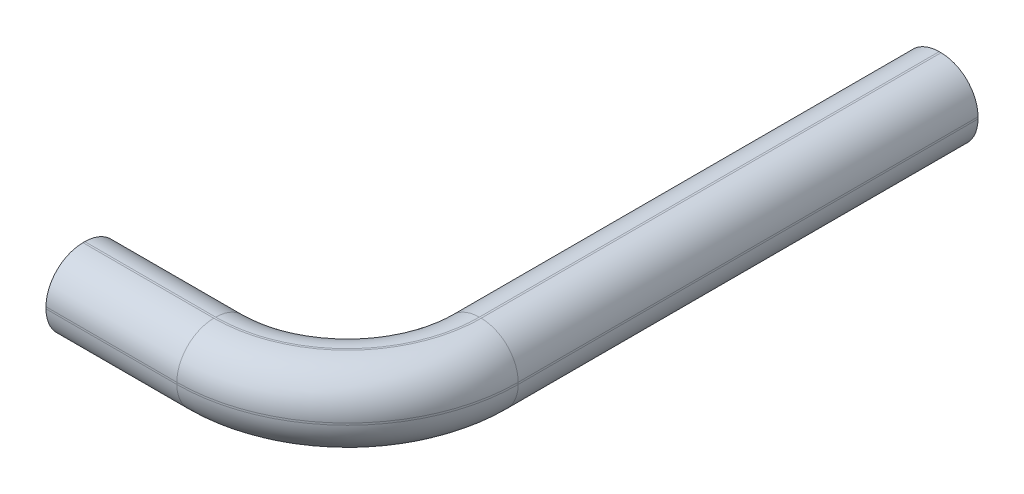
ISO-10303-21;
HEADER;
FILE_DESCRIPTION(('STEP AP214'),'2;1');
FILE_NAME('part.step','',(''),(''),'','','');
FILE_SCHEMA(('AUTOMOTIVE_DESIGN { 1 0 10303 214 1 1 1 1 }'));
ENDSEC;
DATA;
#1=APPLICATION_CONTEXT('core data for automotive mechanical design processes');
#2=APPLICATION_PROTOCOL_DEFINITION('international standard','automotive_design',2000,#1);
#3=PRODUCT_CONTEXT('',#1,'mechanical');
#4=PRODUCT('Part','Part','',(#3));
#5=PRODUCT_RELATED_PRODUCT_CATEGORY('part','',(#4));
#6=PRODUCT_DEFINITION_FORMATION('','',#4);
#7=PRODUCT_DEFINITION_CONTEXT('part definition',#1,'design');
#8=PRODUCT_DEFINITION('design','',#6,#7);
#9=PRODUCT_DEFINITION_SHAPE('','',#8);
#10=(LENGTH_UNIT() NAMED_UNIT(*) SI_UNIT(.MILLI.,.METRE.));
#11=(NAMED_UNIT(*) PLANE_ANGLE_UNIT() SI_UNIT($,.RADIAN.));
#12=(NAMED_UNIT(*) SI_UNIT($,.STERADIAN.) SOLID_ANGLE_UNIT());
#13=UNCERTAINTY_MEASURE_WITH_UNIT(LENGTH_MEASURE(1.E-05),#10,'distance_accuracy_value','');
#14=(GEOMETRIC_REPRESENTATION_CONTEXT(3) GLOBAL_UNCERTAINTY_ASSIGNED_CONTEXT((#13)) GLOBAL_UNIT_ASSIGNED_CONTEXT((#10,
#11,#12)) REPRESENTATION_CONTEXT('',''));
#15=CARTESIAN_POINT('',(0.,0.,0.));
#16=DIRECTION('',(0.,0.,1.));
#17=DIRECTION('',(1.,0.,0.));
#18=AXIS2_PLACEMENT_3D('',#15,#16,#17);
#19=CARTESIAN_POINT('',(21.45999826,0.00999666000000374,1.85000192));
#20=DIRECTION('',(0.,1.,0.));
#21=DIRECTION('',(0.,0.,1.));
#22=AXIS2_PLACEMENT_3D('',#19,#20,#21);
#23=TOROIDAL_SURFACE('',#22,1.39,0.389999999999998);
#24=CARTESIAN_POINT('',(21.45999826,0.009996660000003,1.85000192));
#25=DIRECTION('',(0.,-1.,0.));
#26=DIRECTION('',(0.,0.,-1.));
#27=AXIS2_PLACEMENT_3D('',#24,#25,#26);
#28=CIRCLE('',#27,1.);
#29=CARTESIAN_POINT('',(22.45999826,0.00999666000000325,1.85000192));
#30=VERTEX_POINT('',#29);
#31=CARTESIAN_POINT('',(21.45999826,0.00999666000000301,2.85000192));
#32=VERTEX_POINT('',#31);
#33=EDGE_CURVE('E126',#30,#32,#28,.T.);
#34=ORIENTED_EDGE('',*,*,#33,.T.);
#35=CARTESIAN_POINT('',(21.45999826,0.009996660000003,3.24000192));
#36=DIRECTION('',(-1.,0.,0.));
#37=DIRECTION('',(0.,-1.,0.));
#38=AXIS2_PLACEMENT_3D('',#35,#36,#37);
#39=CIRCLE('',#38,0.39);
#40=CARTESIAN_POINT('',(21.45999826,0.399996660000002,3.24000192));
#41=VERTEX_POINT('',#40);
#42=EDGE_CURVE('E138',#41,#32,#39,.T.);
#43=ORIENTED_EDGE('',*,*,#42,.F.);
#44=CARTESIAN_POINT('',(21.45999826,0.399996660000002,3.24000192));
#45=CARTESIAN_POINT('',(21.4774583821445,0.399996659845648,3.23998873292312));
#46=CARTESIAN_POINT('',(21.4949183122406,0.399996659365852,3.23965029009866));
#47=CARTESIAN_POINT('',(21.5298131957279,0.399996658592444,3.23832345601826));
#48=CARTESIAN_POINT('',(21.5472481494881,0.399996658298828,3.23733507446698));
#49=CARTESIAN_POINT('',(21.5820690346497,0.399996658734792,3.23470892375237));
#50=CARTESIAN_POINT('',(21.5994549659832,0.399996659464374,3.23307115369029));
#51=CARTESIAN_POINT('',(21.6341545950525,0.399996659760702,3.22915163968367));
#52=CARTESIAN_POINT('',(21.6514682915044,0.399996659327428,3.22686988434172));
#53=CARTESIAN_POINT('',(21.6859972984439,0.399996659468801,3.2216536519412));
#54=CARTESIAN_POINT('',(21.703212605565,0.399996660043483,3.21871915268361));
#55=CARTESIAN_POINT('',(21.7326278028288,0.399996644775772,3.21317043130668));
#56=CARTESIAN_POINT('',(21.7448555795716,0.399996633576253,3.21070418444168));
#57=CARTESIAN_POINT('',(21.7576352428846,0.399996634639878,3.2079060517208));
#58=CARTESIAN_POINT('',(21.758231243389,0.399996634718728,3.20777505100112));
#59=CARTESIAN_POINT('',(21.768376294686,0.399996636175981,3.2055378133914));
#60=CARTESIAN_POINT('',(21.7779021415403,0.399996639280238,3.20332611778435));
#61=CARTESIAN_POINT('',(21.8084565479244,0.399996647771011,3.19589357633679));
#62=CARTESIAN_POINT('',(21.8293917642789,0.399996651344799,3.19028296387726));
#63=CARTESIAN_POINT('',(21.8671858225316,0.399996656552783,3.17919693822005));
#64=CARTESIAN_POINT('',(21.8840923230272,0.399996658421747,3.173883185984));
#65=CARTESIAN_POINT('',(21.908135233255,0.399996659603422,3.1658223550518));
#66=CARTESIAN_POINT('',(21.9153593604772,0.399996659765444,3.16333441572606));
#67=CARTESIAN_POINT('',(21.9396438042091,0.399996660120523,3.15475219280093));
#68=CARTESIAN_POINT('',(21.956610455274,0.399996660051575,3.14839014561441));
#69=CARTESIAN_POINT('',(21.9906639980062,0.399996659654268,3.13487121416756));
#70=CARTESIAN_POINT('',(22.0077450994579,0.399996659320144,3.12769974138968));
#71=CARTESIAN_POINT('',(22.0320499529894,0.399996654020013,3.1169326223023));
#72=CARTESIAN_POINT('',(22.039393196791,0.399996651776192,3.11360460303651));
#73=CARTESIAN_POINT('',(22.0565066856184,0.399996644896893,3.10566891938115));
#74=CARTESIAN_POINT('',(22.0662535707215,0.39999663970775,3.1010107649221));
#75=CARTESIAN_POINT('',(22.0929031313145,0.399996624664596,3.08788586615824));
#76=CARTESIAN_POINT('',(22.1096901155138,0.399996614230787,3.07918285354265));
#77=CARTESIAN_POINT('',(22.1428916489718,0.399996595116087,3.06109285158247));
#78=CARTESIAN_POINT('',(22.1593061842663,0.399996586435262,3.05170583664812));
#79=CARTESIAN_POINT('',(22.1917349327225,0.399996573560348,3.03226306688608));
#80=CARTESIAN_POINT('',(22.2077491377087,0.399996569366351,3.02220729841626));
#81=CARTESIAN_POINT('',(22.2393495176332,0.399996566530956,3.0014443243548));
#82=CARTESIAN_POINT('',(22.254935691124,0.399996567889578,2.99073711656043));
#83=CARTESIAN_POINT('',(22.2856538341199,0.399996575840703,2.96869013944598));
#84=CARTESIAN_POINT('',(22.3007858098185,0.399996582433135,2.95735037875733));
#85=CARTESIAN_POINT('',(22.330567551516,0.39999659894139,2.93405565200767));
#86=CARTESIAN_POINT('',(22.3452173322883,0.399996608857112,2.92210070482319));
#87=CARTESIAN_POINT('',(22.3740172402423,0.399996629054596,2.89760410755543));
#88=CARTESIAN_POINT('',(22.3881673912198,0.399996639336341,2.88506248547984));
#89=CARTESIAN_POINT('',(22.415915228668,0.399996654288873,2.85938441115303));
#90=CARTESIAN_POINT('',(22.429512950834,0.399996658960024,2.84624799745069));
#91=CARTESIAN_POINT('',(22.44925854725,0.399996660496644,2.82649661407952));
#92=CARTESIAN_POINT('',(22.4555870467816,0.399996660165179,2.82006014742043));
#93=CARTESIAN_POINT('',(22.4773478368829,0.399996657404839,2.79749417074201));
#94=CARTESIAN_POINT('',(22.4924593380152,0.399996652605717,2.78105175384062));
#95=CARTESIAN_POINT('',(22.5178069405613,0.399996635012539,2.75210817698515));
#96=CARTESIAN_POINT('',(22.5282355827104,0.399996624796594,2.73977461373994));
#97=CARTESIAN_POINT('',(22.5450048703864,0.399996604989869,2.71922335923224));
#98=CARTESIAN_POINT('',(22.5514742135191,0.399996596481087,2.71111043229161));
#99=CARTESIAN_POINT('',(22.5697119210875,0.399996572967516,2.6876987212134));
#100=CARTESIAN_POINT('',(22.5812521794528,0.399996558670009,2.672221045683));
#101=CARTESIAN_POINT('',(22.6025410153385,0.399996542403962,2.64236569371662));
#102=CARTESIAN_POINT('',(22.6123532386915,0.399996539343317,2.62803325504069));
#103=CARTESIAN_POINT('',(22.6322923379845,0.399996542017605,2.59768418829223));
#104=CARTESIAN_POINT('',(22.6423666331882,0.399996548578022,2.58163296021882));
#105=CARTESIAN_POINT('',(22.6618461200804,0.399996564443458,2.54913034250503));
#106=CARTESIAN_POINT('',(22.6712513297791,0.399996573748403,2.53267896365177));
#107=CARTESIAN_POINT('',(22.6893745796057,0.399996594737633,2.49940277500946));
#108=CARTESIAN_POINT('',(22.6980926480219,0.39999660642182,2.48257798062975));
#109=CARTESIAN_POINT('',(22.7148283552992,0.399996628592385,2.44858471096698));
#110=CARTESIAN_POINT('',(22.7228460329741,0.399996639078828,2.43141625479362));
#111=CARTESIAN_POINT('',(22.738162769283,0.399996654750108,2.39676312886538));
#112=CARTESIAN_POINT('',(22.7454618779783,0.399996659935314,2.37927848123953));
#113=CARTESIAN_POINT('',(22.7587949224596,0.399996660059553,2.34542804965404));
#114=CARTESIAN_POINT('',(22.7648832966458,0.399996655779432,2.32908365555748));
#115=CARTESIAN_POINT('',(22.7764608936656,0.399996650224028,2.29618492391058));
#116=CARTESIAN_POINT('',(22.7819501429025,0.399996648948613,2.2796305956479));
#117=CARTESIAN_POINT('',(22.7923218320888,0.399996649772732,2.24633259126315));
#118=CARTESIAN_POINT('',(22.7972042733396,0.399996651872258,2.22958891554726));
#119=CARTESIAN_POINT('',(22.8063441252498,0.399996661289691,2.19593202896907));
#120=CARTESIAN_POINT('',(22.8106015110259,0.399996668607806,2.17901881138599));
#121=CARTESIAN_POINT('',(22.8185339557722,0.399996646317903,2.14505300174819));
#122=CARTESIAN_POINT('',(22.8222089671158,0.399996616706867,2.12800039841433));
#123=CARTESIAN_POINT('',(22.8270925724075,0.399996606910781,2.10258411233844));
#124=CARTESIAN_POINT('',(22.8285954617571,0.399996609107716,2.09427651277749));
#125=CARTESIAN_POINT('',(22.8334659071701,0.399996618857504,2.06586003038684));
#126=CARTESIAN_POINT('',(22.8364628138281,0.399996629590214,2.04568616320354));
#127=CARTESIAN_POINT('',(22.8408475364596,0.399996643943672,2.01089761606242));
#128=CARTESIAN_POINT('',(22.8424509216952,0.399996648714617,1.99630952544468));
#129=CARTESIAN_POINT('',(22.8448714441021,0.399996654865008,1.97054674283321));
#130=CARTESIAN_POINT('',(22.8457848503326,0.399996656779789,1.95938102079739));
#131=CARTESIAN_POINT('',(22.8478721005293,0.399996660043118,1.92946172211877));
#132=CARTESIAN_POINT('',(22.8488033713497,0.399996660129923,1.91069066243443));
#133=CARTESIAN_POINT('',(22.8497795770226,0.399996659881555,1.87794357231215));
#134=CARTESIAN_POINT('',(22.849990560871,0.399996659648884,1.86397230224356));
#135=CARTESIAN_POINT('',(22.84999826,0.399996660000002,1.85000192));
#136=B_SPLINE_CURVE_WITH_KNOTS('',3,(#44,#45,#46,#47,#48,#49,#50,#51,#52,#53,#54,#55,#56,#57,
#58,#59,#60,#61,#62,#63,#64,#65,#66,#67,#68,#69,#70,#71,#72,#73,#74,#75,#76,#77,#78,#79,#80,#81,
#82,#83,#84,#85,#86,#87,#88,#89,#90,#91,#92,#93,#94,#95,#96,#97,#98,#99,#100,#101,#102,#103,
#104,#105,#106,#107,#108,#109,#110,#111,#112,#113,#114,#115,#116,#117,#118,#119,#120,#121,#122,
#123,#124,#125,#126,#127,#128,#129,#130,#131,#132,#133,#134,#135),.UNSPECIFIED.,.F.,.F.,(4,2,2,
2,2,2,2,2,2,2,2,2,2,2,2,2,2,2,2,2,2,2,2,2,2,2,2,2,2,2,2,2,2,2,2,2,2,2,2,2,2,2,2,2,2,4),(0.,
0.0523774607925619,0.104754139521095,0.157130890738411,0.209508568990691,0.261888028816525,
0.299304552687161,0.301135235463463,0.330470965905401,0.395466846147935,0.448619126899979,
0.471540121214233,0.525886523285258,0.58144776916993,0.605633415696794,0.638038989472104,
0.694748358110775,0.751459849440195,0.808172498001421,0.864885338337366,0.921597404993741,
0.97830773251999,1.03501535547025,1.09171930840444,1.11879832247491,1.18576343180251,
1.23420886094146,1.26533626394515,1.32323610769921,1.37533261767111,1.43216846145184,
1.48900277476456,1.54583474710009,1.60266356796249,1.65948842686979,1.71180145625224,
1.76411217927766,1.81642279010981,1.86873548284502,1.92105245149676,1.94637851435654,
2.00754127614339,2.05156216561878,2.08516840424163,2.14153463288351,2.18344647938295),.UNSPECIFIED.);
#137=CARTESIAN_POINT('',(22.84999826,0.399996660000002,1.85000192));
#138=VERTEX_POINT('',#137);
#139=EDGE_CURVE('E196',#41,#138,#136,.T.);
#140=ORIENTED_EDGE('',*,*,#139,.T.);
#141=CARTESIAN_POINT('',(22.84999826,0.00999666000000301,1.85000192));
#142=DIRECTION('',(0.,0.,1.));
#143=DIRECTION('',(1.,0.,0.));
#144=AXIS2_PLACEMENT_3D('',#141,#142,#143);
#145=CIRCLE('',#144,0.389999999999999);
#146=EDGE_CURVE('E185',#138,#30,#145,.T.);
#147=ORIENTED_EDGE('',*,*,#146,.T.);
#148=EDGE_LOOP('',(#34,#43,#140,#147));
#149=FACE_BOUND('',#148,.T.);
#150=ADVANCED_FACE('F17',(#149),#23,.T.);
#151=CARTESIAN_POINT('',(22.86999666,0.009996660000003,1.85000032));
#152=DIRECTION('',(0.,0.,-1.));
#153=DIRECTION('',(0.,1.,0.));
#154=AXIS2_PLACEMENT_3D('',#151,#152,#153);
#155=CYLINDRICAL_SURFACE('',#154,0.39);
#156=CARTESIAN_POINT('',(22.86999666,0.00999666000000301,1.85000032));
#157=DIRECTION('',(0.,0.,1.));
#158=DIRECTION('',(1.,0.,0.));
#159=AXIS2_PLACEMENT_3D('',#156,#157,#158);
#160=CIRCLE('',#159,0.389999999999998);
#161=CARTESIAN_POINT('',(23.25999666,0.00999666000000302,1.85000032));
#162=VERTEX_POINT('',#161);
#163=CARTESIAN_POINT('',(22.86999666,0.39999666,1.85000032));
#164=VERTEX_POINT('',#163);
#165=EDGE_CURVE('E115',#162,#164,#160,.T.);
#166=ORIENTED_EDGE('',*,*,#165,.F.);
#167=DIRECTION('',(0.,0.,1.));
#168=VECTOR('',#167,1.);
#169=CARTESIAN_POINT('',(23.25999666,0.00999666000000302,3.65000032));
#170=LINE('',#169,#168);
#171=CARTESIAN_POINT('',(23.25999666,0.00999666000000352,-2.99999908));
#172=VERTEX_POINT('',#171);
#173=EDGE_CURVE('E141',#162,#172,#170,.F.);
#174=ORIENTED_EDGE('',*,*,#173,.T.);
#175=CARTESIAN_POINT('',(22.86999666,0.00999666000000408,-2.99999908));
#176=DIRECTION('',(0.,0.,-1.));
#177=DIRECTION('',(0.,1.,0.));
#178=AXIS2_PLACEMENT_3D('',#175,#176,#177);
#179=CIRCLE('',#178,0.39);
#180=CARTESIAN_POINT('',(22.86999666,0.399996660000001,-2.99999908));
#181=VERTEX_POINT('',#180);
#182=EDGE_CURVE('E21',#172,#181,#179,.F.);
#183=ORIENTED_EDGE('',*,*,#182,.T.);
#184=DIRECTION('',(0.,0.,-1.));
#185=VECTOR('',#184,1.);
#186=CARTESIAN_POINT('',(22.86999666,0.39999666,3.65000032));
#187=LINE('',#186,#185);
#188=EDGE_CURVE('E137',#181,#164,#187,.F.);
#189=ORIENTED_EDGE('',*,*,#188,.T.);
#190=EDGE_LOOP('',(#166,#174,#183,#189));
#191=FACE_BOUND('',#190,.T.);
#192=ADVANCED_FACE('F140',(#191),#155,.T.);
#193=CARTESIAN_POINT('',(21.45999666,0.00999666000000435,1.85000032));
#194=DIRECTION('',(0.,-1.,0.));
#195=DIRECTION('',(1.,0.,0.));
#196=AXIS2_PLACEMENT_3D('',#193,#194,#195);
#197=TOROIDAL_SURFACE('',#196,1.41,0.389999999999998);
#198=CARTESIAN_POINT('',(21.45999666,0.00999666000000323,1.85000032));
#199=DIRECTION('',(0.,1.,0.));
#200=DIRECTION('',(0.,0.,1.));
#201=AXIS2_PLACEMENT_3D('',#198,#199,#200);
#202=CIRCLE('',#201,1.8);
#203=CARTESIAN_POINT('',(21.45999666,0.00999666000000293,3.65000032));
#204=VERTEX_POINT('',#203);
#205=EDGE_CURVE('E163',#162,#204,#202,.F.);
#206=ORIENTED_EDGE('',*,*,#205,.F.);
#207=ORIENTED_EDGE('',*,*,#165,.T.);
#208=CARTESIAN_POINT('',(22.86999666,0.399996660000001,1.85000032));
#209=CARTESIAN_POINT('',(22.8699834738934,0.399996659844008,1.86771156606512));
#210=CARTESIAN_POINT('',(22.8696403311503,0.399996659366847,1.8854226203339));
#211=CARTESIAN_POINT('',(22.8682947079682,0.39999665860504,1.92081940102775));
#212=CARTESIAN_POINT('',(22.8672922372201,0.399996658320391,1.93850512782124));
#213=CARTESIAN_POINT('',(22.8646285311604,0.399996658778406,1.97382685823295));
#214=CARTESIAN_POINT('',(22.8629672948479,0.399996659521071,1.99146286177556));
#215=CARTESIAN_POINT('',(22.8589915272914,0.3999966597775,2.02666159094361));
#216=CARTESIAN_POINT('',(22.8566769844606,0.399996659291243,2.04422431526377));
#217=CARTESIAN_POINT('',(22.8513858150336,0.399996659332336,2.07924997122972));
#218=CARTESIAN_POINT('',(22.84840916596,0.399996659859721,2.09671289946693));
#219=CARTESIAN_POINT('',(22.8427804882697,0.399996644037528,2.12655114309181));
#220=CARTESIAN_POINT('',(22.8402786338937,0.399996632466058,2.13895476153983));
#221=CARTESIAN_POINT('',(22.8374395199207,0.399996633521755,2.15192227095209));
#222=CARTESIAN_POINT('',(22.8373057586124,0.399996633601819,2.15253085021228));
#223=CARTESIAN_POINT('',(22.8350339016457,0.399996635081451,2.16283293584828));
#224=CARTESIAN_POINT('',(22.8327885180159,0.399996638334016,2.17250283527878));
#225=CARTESIAN_POINT('',(22.8252473168779,0.399996647213651,2.20349994730745));
#226=CARTESIAN_POINT('',(22.8195565199063,0.39999665093203,2.22473255343881));
#227=CARTESIAN_POINT('',(22.8083133592039,0.399996656369084,2.26305963367479));
#228=CARTESIAN_POINT('',(22.8029250844176,0.399996658328797,2.28020248498067));
#229=CARTESIAN_POINT('',(22.7947485013794,0.399996659574784,2.30459026579817));
#230=CARTESIAN_POINT('',(22.7922227048683,0.399996659747436,2.31192405550837));
#231=CARTESIAN_POINT('',(22.7835125323558,0.399996660125175,2.33656918347991));
#232=CARTESIAN_POINT('',(22.7770564132421,0.399996660050672,2.35378545928334));
#233=CARTESIAN_POINT('',(22.763341698692,0.399996659646232,2.38832919714392));
#234=CARTESIAN_POINT('',(22.7560687159418,0.399996659310782,2.40565094827088));
#235=CARTESIAN_POINT('',(22.74515079435,0.399996653888017,2.43029513405837));
#236=CARTESIAN_POINT('',(22.7417772094424,0.399996651592009,2.43773872933787));
#237=CARTESIAN_POINT('',(22.7337297441021,0.399996644544749,2.4550931384075));
#238=CARTESIAN_POINT('',(22.729004558796,0.399996639223407,2.46498021517213));
#239=CARTESIAN_POINT('',(22.715690798836,0.399996623793767,2.49201308214193));
#240=CARTESIAN_POINT('',(22.7068625602343,0.399996613088468,2.50904151756037));
#241=CARTESIAN_POINT('',(22.6885122808103,0.399996593472364,2.54272060042666));
#242=CARTESIAN_POINT('',(22.6789902140697,0.399996584561628,2.55937123373104));
#243=CARTESIAN_POINT('',(22.6592677324851,0.399996571342515,2.59226642455319));
#244=CARTESIAN_POINT('',(22.6490673038277,0.399996567034232,2.60851097379264));
#245=CARTESIAN_POINT('',(22.6280056503883,0.399996564115341,2.64056589209569));
#246=CARTESIAN_POINT('',(22.6171444233827,0.399996565504752,2.65637625969809));
#247=CARTESIAN_POINT('',(22.5947803170077,0.399996573655436,2.68753626295496));
#248=CARTESIAN_POINT('',(22.5832774463915,0.399996580416636,2.70288590489022));
#249=CARTESIAN_POINT('',(22.5596476671389,0.399996597350541,2.73309605871168));
#250=CARTESIAN_POINT('',(22.5475207776355,0.399996607523141,2.74795658557166));
#251=CARTESIAN_POINT('',(22.5226718371929,0.399996628246696,2.77717078076171));
#252=CARTESIAN_POINT('',(22.5099498146394,0.399996638797632,2.79152447320867));
#253=CARTESIAN_POINT('',(22.4839024932627,0.399996654137991,2.81967155962929));
#254=CARTESIAN_POINT('',(22.4705772334974,0.399996658927787,2.83346498976896));
#255=CARTESIAN_POINT('',(22.450528513273,0.399996660513075,2.85350761802609));
#256=CARTESIAN_POINT('',(22.4439860516507,0.399996660174899,2.85993996317996));
#257=CARTESIAN_POINT('',(22.4210851289351,0.399996657350549,2.88202174488437));
#258=CARTESIAN_POINT('',(22.4044098180134,0.399996652440645,2.89734631767799));
#259=CARTESIAN_POINT('',(22.3750623049468,0.399996634384998,2.92304628829763));
#260=CARTESIAN_POINT('',(22.3625602069177,0.399996623896237,2.9336171165055));
#261=CARTESIAN_POINT('',(22.3417191119664,0.399996603539686,2.95062285725828));
#262=CARTESIAN_POINT('',(22.3334860586981,0.399996594785247,2.95718791612231));
#263=CARTESIAN_POINT('',(22.3097321486737,0.399996570583808,2.97569182060513));
#264=CARTESIAN_POINT('',(22.2940298354364,0.399996555852202,2.98739928475022));
#265=CARTESIAN_POINT('',(22.2637478476626,0.399996539056733,3.00899171682302));
#266=CARTESIAN_POINT('',(22.2492142525213,0.39999653586709,3.01894151693539));
#267=CARTESIAN_POINT('',(22.218433910614,0.399996538541784,3.03916395544137));
#268=CARTESIAN_POINT('',(22.2021519408602,0.399996545259748,3.04938306668006));
#269=CARTESIAN_POINT('',(22.1691820829184,0.399996561545753,3.06914255448146));
#270=CARTESIAN_POINT('',(22.1524942057089,0.399996571113717,3.07868294937397));
#271=CARTESIAN_POINT('',(22.1187396499063,0.399996592717916,3.09706667989181));
#272=CARTESIAN_POINT('',(22.1016729869953,0.399996604754051,3.10591004430606));
#273=CARTESIAN_POINT('',(22.0671910399812,0.399996627603857,3.12288626442396));
#274=CARTESIAN_POINT('',(22.0497757753255,0.399996638417597,3.13101915962747));
#275=CARTESIAN_POINT('',(22.0146244854267,0.399996654582078,3.14655598165377));
#276=CARTESIAN_POINT('',(21.9968884827037,0.399996659933201,3.15395995942271));
#277=CARTESIAN_POINT('',(21.9625508348962,0.3999966600615,3.16748480928626));
#278=CARTESIAN_POINT('',(21.9459708777452,0.399996655644177,3.1736608789045));
#279=CARTESIAN_POINT('',(21.9125980096557,0.3999966499106,3.18540525068041));
#280=CARTESIAN_POINT('',(21.8958051082208,0.399996648594209,3.19097357985546));
#281=CARTESIAN_POINT('',(21.8620272383138,0.39999664944778,3.20149469230311));
#282=CARTESIAN_POINT('',(21.8450422703146,0.399996651617734,3.20644747709118));
#283=CARTESIAN_POINT('',(21.8109003665492,0.399996661329718,3.21571903385511));
#284=CARTESIAN_POINT('',(21.7937434240082,0.39999666887196,3.22003778074789));
#285=CARTESIAN_POINT('',(21.7592881555852,0.399996645882967,3.22808453084633));
#286=CARTESIAN_POINT('',(21.7419898182866,0.399996615348625,3.23181248584364));
#287=CARTESIAN_POINT('',(21.7161972885346,0.39999660514611,3.23676848905706));
#288=CARTESIAN_POINT('',(21.7077599355743,0.399996607373827,3.23829479293726));
#289=CARTESIAN_POINT('',(21.678927916842,0.39999661734722,3.24323584841014));
#290=CARTESIAN_POINT('',(21.6584673843369,0.399996628443019,3.24627485795784));
#291=CARTESIAN_POINT('',(21.6231889707748,0.399996643285003,3.25072066528652));
#292=CARTESIAN_POINT('',(21.6083980634824,0.399996648219715,3.25234618971042));
#293=CARTESIAN_POINT('',(21.5822624228597,0.399996654604887,3.25480165183358));
#294=CARTESIAN_POINT('',(21.570926747509,0.399996656602316,3.25572880096307));
#295=CARTESIAN_POINT('',(21.5405633960291,0.399996660016711,3.25784626892668));
#296=CARTESIAN_POINT('',(21.5215179936859,0.399996660127675,3.25879055462276));
#297=CARTESIAN_POINT('',(21.4883104207215,0.399996659887604,3.25977922541291));
#298=CARTESIAN_POINT('',(21.4741530896274,0.399996659648131,3.25999267601828));
#299=CARTESIAN_POINT('',(21.45999666,0.399996660000002,3.26000032));
#300=B_SPLINE_CURVE_WITH_KNOTS('',3,(#208,#209,#210,#211,#212,#213,#214,#215,#216,#217,#218,
#219,#220,#221,#222,#223,#224,#225,#226,#227,#228,#229,#230,#231,#232,#233,#234,#235,#236,#237,
#238,#239,#240,#241,#242,#243,#244,#245,#246,#247,#248,#249,#250,#251,#252,#253,#254,#255,#256,
#257,#258,#259,#260,#261,#262,#263,#264,#265,#266,#267,#268,#269,#270,#271,#272,#273,#274,#275,
#276,#277,#278,#279,#280,#281,#282,#283,#284,#285,#286,#287,#288,#289,#290,#291,#292,#293,#294,
#295,#296,#297,#298,#299),.UNSPECIFIED.,.F.,.F.,(4,2,2,2,2,2,2,2,2,2,2,2,2,2,2,2,2,2,2,2,2,2,2,
2,2,2,2,2,2,2,2,2,2,2,2,2,2,2,2,2,2,2,2,2,2,4),(0.,0.0531307889727896,0.106260797041364,
0.159390885843743,0.212521917011049,0.265654752166565,0.30360943429733,0.305478751422976,
0.335258262889627,0.401177817611433,0.455073382973426,0.478342405564347,0.533488871425045,
0.589833462575378,0.614349733426186,0.647221444732965,0.704746545269528,0.762273795784552,
0.819802218079974,0.877330833959695,0.934858665230532,0.992384733703149,1.04990806119304,
1.10742766952161,1.13495183052916,1.20286350480995,1.25197032420069,1.28355848267883,
1.34229814857687,1.39512561196931,1.45277847952525,1.51042978948309,1.56807871706424,
1.62572443750403,1.68336612605235,1.73643306017108,1.78949763421351,1.84256207760758,
1.89562861971059,1.94869948979348,1.97442107578366,2.03645273485255,2.08108560121312,
2.11520331454822,2.17239324570524,2.21486324616979),.UNSPECIFIED.);
#301=CARTESIAN_POINT('',(21.45999666,0.399996660000001,3.26000032));
#302=VERTEX_POINT('',#301);
#303=EDGE_CURVE('E147',#164,#302,#300,.T.);
#304=ORIENTED_EDGE('',*,*,#303,.T.);
#305=CARTESIAN_POINT('',(21.45999666,0.00999666000000283,3.26000032));
#306=DIRECTION('',(1.,0.,0.));
#307=DIRECTION('',(0.,1.,0.));
#308=AXIS2_PLACEMENT_3D('',#305,#306,#307);
#309=CIRCLE('',#308,0.39);
#310=EDGE_CURVE('E171',#204,#302,#309,.F.);
#311=ORIENTED_EDGE('',*,*,#310,.F.);
#312=EDGE_LOOP('',(#206,#207,#304,#311));
#313=FACE_BOUND('',#312,.T.);
#314=ADVANCED_FACE('F213',(#313),#197,.T.);
#315=CARTESIAN_POINT('',(20.07999794,0.009996660000003,3.26000032));
#316=DIRECTION('',(1.,0.,0.));
#317=DIRECTION('',(0.,1.,0.));
#318=AXIS2_PLACEMENT_3D('',#315,#316,#317);
#319=CYLINDRICAL_SURFACE('',#318,0.39);
#320=CARTESIAN_POINT('',(20.07999794,0.009996660000003,3.26000032));
#321=DIRECTION('',(1.,0.,0.));
#322=DIRECTION('',(0.,1.,0.));
#323=AXIS2_PLACEMENT_3D('',#320,#321,#322);
#324=CIRCLE('',#323,0.39);
#325=CARTESIAN_POINT('',(20.07999794,0.39999666,3.26000032));
#326=VERTEX_POINT('',#325);
#327=CARTESIAN_POINT('',(20.07999794,0.00999666000000297,3.65000032));
#328=VERTEX_POINT('',#327);
#329=EDGE_CURVE('E174',#326,#328,#324,.T.);
#330=ORIENTED_EDGE('',*,*,#329,.T.);
#331=DIRECTION('',(1.,0.,0.));
#332=VECTOR('',#331,1.);
#333=CARTESIAN_POINT('',(20.07999794,0.00999666000000302,3.65000032));
#334=LINE('',#333,#332);
#335=EDGE_CURVE('E159',#328,#204,#334,.T.);
#336=ORIENTED_EDGE('',*,*,#335,.T.);
#337=ORIENTED_EDGE('',*,*,#310,.T.);
#338=DIRECTION('',(1.,0.,0.));
#339=VECTOR('',#338,1.);
#340=CARTESIAN_POINT('',(20.07999794,0.39999666,3.26000032));
#341=LINE('',#340,#339);
#342=EDGE_CURVE('E149',#302,#326,#341,.F.);
#343=ORIENTED_EDGE('',*,*,#342,.T.);
#344=EDGE_LOOP('',(#330,#336,#337,#343));
#345=FACE_BOUND('',#344,.T.);
#346=ADVANCED_FACE('F216',(#345),#319,.T.);
#347=CARTESIAN_POINT('',(21.45999826,0.009996660000003,3.24000192));
#348=DIRECTION('',(-1.,0.,0.));
#349=DIRECTION('',(0.,-1.,0.));
#350=AXIS2_PLACEMENT_3D('',#347,#348,#349);
#351=CYLINDRICAL_SURFACE('',#350,0.39);
#352=ORIENTED_EDGE('',*,*,#42,.T.);
#353=DIRECTION('',(1.,0.,0.));
#354=VECTOR('',#353,1.);
#355=CARTESIAN_POINT('',(22.45999826,0.00999666000000302,2.85000192));
#356=LINE('',#355,#354);
#357=CARTESIAN_POINT('',(20.07999794,0.00999666000000309,2.85000192));
#358=VERTEX_POINT('',#357);
#359=EDGE_CURVE('E329',#32,#358,#356,.F.);
#360=ORIENTED_EDGE('',*,*,#359,.T.);
#361=CARTESIAN_POINT('',(20.07999794,0.00999666000000317,3.24000192));
#362=DIRECTION('',(-1.,0.,0.));
#363=DIRECTION('',(0.,-1.,0.));
#364=AXIS2_PLACEMENT_3D('',#361,#362,#363);
#365=CIRCLE('',#364,0.39);
#366=CARTESIAN_POINT('',(20.07999794,0.39999666,3.24000192));
#367=VERTEX_POINT('',#366);
#368=EDGE_CURVE('E156',#358,#367,#365,.F.);
#369=ORIENTED_EDGE('',*,*,#368,.T.);
#370=DIRECTION('',(1.,0.,0.));
#371=VECTOR('',#370,1.);
#372=CARTESIAN_POINT('',(20.07999794,0.39999666,3.24000192));
#373=LINE('',#372,#371);
#374=EDGE_CURVE('E192',#367,#41,#373,.T.);
#375=ORIENTED_EDGE('',*,*,#374,.T.);
#376=EDGE_LOOP('',(#352,#360,#369,#375));
#377=FACE_BOUND('',#376,.T.);
#378=ADVANCED_FACE('F365',(#377),#351,.T.);
#379=CARTESIAN_POINT('',(20.07999794,0.39999666,3.65000032));
#380=DIRECTION('',(0.,-1.,0.));
#381=DIRECTION('',(0.,0.,-1.));
#382=AXIS2_PLACEMENT_3D('',#379,#380,#381);
#383=PLANE('',#382);
#384=ORIENTED_EDGE('',*,*,#374,.F.);
#385=DIRECTION('',(0.,0.,-1.));
#386=VECTOR('',#385,1.);
#387=CARTESIAN_POINT('',(20.07999794,0.39999666,3.65000032));
#388=LINE('',#387,#386);
#389=EDGE_CURVE('E190',#326,#367,#388,.T.);
#390=ORIENTED_EDGE('',*,*,#389,.F.);
#391=ORIENTED_EDGE('',*,*,#342,.F.);
#392=ORIENTED_EDGE('',*,*,#303,.F.);
#393=ORIENTED_EDGE('',*,*,#188,.F.);
#394=DIRECTION('',(1.,0.,0.));
#395=VECTOR('',#394,1.);
#396=CARTESIAN_POINT('',(20.07999794,0.399996660000002,-2.99999908));
#397=LINE('',#396,#395);
#398=CARTESIAN_POINT('',(22.84999826,0.399996660000003,-2.99999908));
#399=VERTEX_POINT('',#398);
#400=EDGE_CURVE('E129',#399,#181,#397,.T.);
#401=ORIENTED_EDGE('',*,*,#400,.F.);
#402=DIRECTION('',(0.,0.,1.));
#403=VECTOR('',#402,1.);
#404=CARTESIAN_POINT('',(22.84999826,0.399996660000004,-2.99999908));
#405=LINE('',#404,#403);
#406=EDGE_CURVE('E339',#138,#399,#405,.F.);
#407=ORIENTED_EDGE('',*,*,#406,.F.);
#408=ORIENTED_EDGE('',*,*,#139,.F.);
#409=EDGE_LOOP('',(#384,#390,#391,#392,#393,#401,#407,#408));
#410=FACE_BOUND('',#409,.T.);
#411=ADVANCED_FACE('F145',(#410),#383,.F.);
#412=CARTESIAN_POINT('',(21.45999826,-0.40000174,1.85000192));
#413=DIRECTION('',(0.,1.,0.));
#414=DIRECTION('',(0.,0.,1.));
#415=AXIS2_PLACEMENT_3D('',#412,#413,#414);
#416=CYLINDRICAL_SURFACE('',#415,1.);
#417=ORIENTED_EDGE('',*,*,#33,.F.);
#418=DIRECTION('',(0.,1.,0.));
#419=VECTOR('',#418,1.);
#420=CARTESIAN_POINT('',(22.45999826,-0.40000174,1.85000192));
#421=LINE('',#420,#419);
#422=CARTESIAN_POINT('',(22.45999826,-0.01000174,1.85000192));
#423=VERTEX_POINT('',#422);
#424=EDGE_CURVE('E182',#423,#30,#421,.T.);
#425=ORIENTED_EDGE('',*,*,#424,.F.);
#426=CARTESIAN_POINT('',(21.45999826,-0.01000174,1.85000192));
#427=DIRECTION('',(0.,1.,0.));
#428=DIRECTION('',(0.,0.,1.));
#429=AXIS2_PLACEMENT_3D('',#426,#427,#428);
#430=CIRCLE('',#429,1.);
#431=CARTESIAN_POINT('',(21.45999826,-0.01000174,2.85000192));
#432=VERTEX_POINT('',#431);
#433=EDGE_CURVE('E308',#432,#423,#430,.T.);
#434=ORIENTED_EDGE('',*,*,#433,.F.);
#435=DIRECTION('',(0.,-1.,0.));
#436=VECTOR('',#435,1.);
#437=CARTESIAN_POINT('',(21.45999826,-0.40000174,2.85000192));
#438=LINE('',#437,#436);
#439=EDGE_CURVE('E327',#432,#32,#438,.F.);
#440=ORIENTED_EDGE('',*,*,#439,.T.);
#441=EDGE_LOOP('',(#417,#425,#434,#440));
#442=FACE_BOUND('',#441,.T.);
#443=ADVANCED_FACE('F370',(#442),#416,.F.);
#444=CARTESIAN_POINT('',(23.25999666,-0.40000174,3.65000032));
#445=DIRECTION('',(-1.,0.,0.));
#446=DIRECTION('',(0.,-1.,0.));
#447=AXIS2_PLACEMENT_3D('',#444,#445,#446);
#448=PLANE('',#447);
#449=ORIENTED_EDGE('',*,*,#173,.F.);
#450=DIRECTION('',(0.,1.,0.));
#451=VECTOR('',#450,1.);
#452=CARTESIAN_POINT('',(23.25999666,-0.40000174,1.85000032));
#453=LINE('',#452,#451);
#454=CARTESIAN_POINT('',(23.25999666,-0.0100017400000002,1.85000032));
#455=VERTEX_POINT('',#454);
#456=EDGE_CURVE('E168',#455,#162,#453,.T.);
#457=ORIENTED_EDGE('',*,*,#456,.F.);
#458=DIRECTION('',(0.,0.,-1.));
#459=VECTOR('',#458,1.);
#460=CARTESIAN_POINT('',(23.25999666,-0.0100017400000011,1.85000032));
#461=LINE('',#460,#459);
#462=CARTESIAN_POINT('',(23.25999666,-0.0100017399999995,-2.99999908));
#463=VERTEX_POINT('',#462);
#464=EDGE_CURVE('E307',#463,#455,#461,.F.);
#465=ORIENTED_EDGE('',*,*,#464,.F.);
#466=DIRECTION('',(0.,-1.,0.));
#467=VECTOR('',#466,1.);
#468=CARTESIAN_POINT('',(23.25999666,-0.40000174,-2.99999908));
#469=LINE('',#468,#467);
#470=EDGE_CURVE('E181',#172,#463,#469,.T.);
#471=ORIENTED_EDGE('',*,*,#470,.F.);
#472=EDGE_LOOP('',(#449,#457,#465,#471));
#473=FACE_BOUND('',#472,.T.);
#474=ADVANCED_FACE('F412',(#473),#448,.F.);
#475=CARTESIAN_POINT('',(21.45999666,-0.40000174,1.85000032));
#476=DIRECTION('',(0.,1.,0.));
#477=DIRECTION('',(0.,0.,1.));
#478=AXIS2_PLACEMENT_3D('',#475,#476,#477);
#479=CYLINDRICAL_SURFACE('',#478,1.8);
#480=ORIENTED_EDGE('',*,*,#456,.T.);
#481=ORIENTED_EDGE('',*,*,#205,.T.);
#482=DIRECTION('',(0.,1.,0.));
#483=VECTOR('',#482,1.);
#484=CARTESIAN_POINT('',(21.45999666,-0.40000174,3.65000032));
#485=LINE('',#484,#483);
#486=CARTESIAN_POINT('',(21.45999666,-0.01000174,3.65000032));
#487=VERTEX_POINT('',#486);
#488=EDGE_CURVE('E162',#204,#487,#485,.F.);
#489=ORIENTED_EDGE('',*,*,#488,.T.);
#490=CARTESIAN_POINT('',(21.45999666,-0.01000174,1.85000032));
#491=DIRECTION('',(0.,-1.,0.));
#492=DIRECTION('',(0.,0.,-1.));
#493=AXIS2_PLACEMENT_3D('',#490,#491,#492);
#494=CIRCLE('',#493,1.8);
#495=EDGE_CURVE('E302',#455,#487,#494,.T.);
#496=ORIENTED_EDGE('',*,*,#495,.F.);
#497=EDGE_LOOP('',(#480,#481,#489,#496));
#498=FACE_BOUND('',#497,.T.);
#499=ADVANCED_FACE('F399',(#498),#479,.T.);
#500=CARTESIAN_POINT('',(20.07999794,-0.40000174,3.65000032));
#501=DIRECTION('',(0.,0.,-1.));
#502=DIRECTION('',(0.,1.,0.));
#503=AXIS2_PLACEMENT_3D('',#500,#501,#502);
#504=PLANE('',#503);
#505=DIRECTION('',(1.,0.,0.));
#506=VECTOR('',#505,1.);
#507=CARTESIAN_POINT('',(20.07999794,-0.0100017399999998,3.65000032));
#508=LINE('',#507,#506);
#509=CARTESIAN_POINT('',(20.07999794,-0.0100017399999999,3.65000032));
#510=VERTEX_POINT('',#509);
#511=EDGE_CURVE('E293',#487,#510,#508,.F.);
#512=ORIENTED_EDGE('',*,*,#511,.F.);
#513=ORIENTED_EDGE('',*,*,#488,.F.);
#514=ORIENTED_EDGE('',*,*,#335,.F.);
#515=DIRECTION('',(0.,1.,0.));
#516=VECTOR('',#515,1.);
#517=CARTESIAN_POINT('',(20.07999794,-0.40000174,3.65000032));
#518=LINE('',#517,#516);
#519=EDGE_CURVE('E330',#510,#328,#518,.T.);
#520=ORIENTED_EDGE('',*,*,#519,.F.);
#521=EDGE_LOOP('',(#512,#513,#514,#520));
#522=FACE_BOUND('',#521,.T.);
#523=ADVANCED_FACE('F395',(#522),#504,.F.);
#524=CARTESIAN_POINT('',(22.45999826,-0.40000174,2.85000192));
#525=DIRECTION('',(0.,0.,1.));
#526=DIRECTION('',(0.,-1.,0.));
#527=AXIS2_PLACEMENT_3D('',#524,#525,#526);
#528=PLANE('',#527);
#529=ORIENTED_EDGE('',*,*,#359,.F.);
#530=ORIENTED_EDGE('',*,*,#439,.F.);
#531=DIRECTION('',(-1.,0.,0.));
#532=VECTOR('',#531,1.);
#533=CARTESIAN_POINT('',(21.45999826,-0.0100017399999999,2.85000192));
#534=LINE('',#533,#532);
#535=CARTESIAN_POINT('',(20.07999794,-0.0100017399999998,2.85000192));
#536=VERTEX_POINT('',#535);
#537=EDGE_CURVE('E284',#536,#432,#534,.F.);
#538=ORIENTED_EDGE('',*,*,#537,.F.);
#539=DIRECTION('',(0.,1.,0.));
#540=VECTOR('',#539,1.);
#541=CARTESIAN_POINT('',(20.07999794,-0.40000174,2.85000192));
#542=LINE('',#541,#540);
#543=EDGE_CURVE('E289',#536,#358,#542,.T.);
#544=ORIENTED_EDGE('',*,*,#543,.T.);
#545=EDGE_LOOP('',(#529,#530,#538,#544));
#546=FACE_BOUND('',#545,.T.);
#547=ADVANCED_FACE('F230',(#546),#528,.F.);
#548=CARTESIAN_POINT('',(22.84999826,0.009996660000004,-2.99999908));
#549=DIRECTION('',(0.,0.,1.));
#550=DIRECTION('',(0.,-1.,0.));
#551=AXIS2_PLACEMENT_3D('',#548,#549,#550);
#552=CYLINDRICAL_SURFACE('',#551,0.39);
#553=CARTESIAN_POINT('',(22.84999826,0.009996660000004,-2.99999908));
#554=DIRECTION('',(0.,0.,1.));
#555=DIRECTION('',(0.,-1.,0.));
#556=AXIS2_PLACEMENT_3D('',#553,#554,#555);
#557=CIRCLE('',#556,0.39);
#558=CARTESIAN_POINT('',(22.45999826,0.009996660000004,-2.99999908));
#559=VERTEX_POINT('',#558);
#560=EDGE_CURVE('E132',#399,#559,#557,.T.);
#561=ORIENTED_EDGE('',*,*,#560,.T.);
#562=DIRECTION('',(0.,0.,1.));
#563=VECTOR('',#562,1.);
#564=CARTESIAN_POINT('',(22.45999826,0.00999666000000399,-2.99999908));
#565=LINE('',#564,#563);
#566=EDGE_CURVE('E283',#559,#30,#565,.T.);
#567=ORIENTED_EDGE('',*,*,#566,.T.);
#568=ORIENTED_EDGE('',*,*,#146,.F.);
#569=ORIENTED_EDGE('',*,*,#406,.T.);
#570=EDGE_LOOP('',(#561,#567,#568,#569));
#571=FACE_BOUND('',#570,.T.);
#572=ADVANCED_FACE('F221',(#571),#552,.T.);
#573=CARTESIAN_POINT('',(21.45999826,-0.0100017400000008,1.85000192));
#574=DIRECTION('',(0.,1.,0.));
#575=DIRECTION('',(0.,0.,1.));
#576=AXIS2_PLACEMENT_3D('',#573,#574,#575);
#577=TOROIDAL_SURFACE('',#576,1.39,0.39);
#578=CARTESIAN_POINT('',(21.45999826,-0.40000174,3.24000192));
#579=CARTESIAN_POINT('',(21.7256353131849,-0.40000174,3.23961145918593));
#580=CARTESIAN_POINT('',(21.9716499062913,-0.40000174,3.142407658477));
#581=CARTESIAN_POINT('',(22.2384733097902,-0.40000174,3.0369820062395));
#582=CARTESIAN_POINT('',(22.4428766858493,-0.40000174,2.83288034584967));
#583=CARTESIAN_POINT('',(22.6458363866933,-0.40000174,2.63022022969534));
#584=CARTESIAN_POINT('',(22.7524039984764,-0.40000174,2.36165356629122));
#585=CARTESIAN_POINT('',(22.8496066349232,-0.40000174,2.11668807154302));
#586=CARTESIAN_POINT('',(22.84999826,-0.40000174,1.85000192));
#587=B_SPLINE_CURVE_WITH_KNOTS('',2,(#578,#579,#580,#581,#582,#583,#584,#585,#586),
.UNSPECIFIED.,.F.,.F.,(3,2,2,2,3),(0.,0.25,0.5,0.75,1.),.UNSPECIFIED.);
#588=CARTESIAN_POINT('',(21.45999826,-0.40000174,3.24000192));
#589=VERTEX_POINT('',#588);
#590=CARTESIAN_POINT('',(22.84999826,-0.400001740000001,1.85000192));
#591=VERTEX_POINT('',#590);
#592=EDGE_CURVE('E249',#589,#591,#587,.T.);
#593=ORIENTED_EDGE('',*,*,#592,.F.);
#594=CARTESIAN_POINT('',(21.45999826,-0.01000174,3.24000192));
#595=DIRECTION('',(-1.,0.,0.));
#596=DIRECTION('',(0.,-1.,0.));
#597=AXIS2_PLACEMENT_3D('',#594,#595,#596);
#598=CIRCLE('',#597,0.39);
#599=EDGE_CURVE('E280',#432,#589,#598,.T.);
#600=ORIENTED_EDGE('',*,*,#599,.F.);
#601=ORIENTED_EDGE('',*,*,#433,.T.);
#602=CARTESIAN_POINT('',(22.84999826,-0.01000174,1.85000192));
#603=DIRECTION('',(0.,0.,1.));
#604=DIRECTION('',(1.,0.,0.));
#605=AXIS2_PLACEMENT_3D('',#602,#603,#604);
#606=CIRCLE('',#605,0.390000000000001);
#607=EDGE_CURVE('E305',#423,#591,#606,.T.);
#608=ORIENTED_EDGE('',*,*,#607,.T.);
#609=EDGE_LOOP('',(#593,#600,#601,#608));
#610=FACE_BOUND('',#609,.T.);
#611=ADVANCED_FACE('F218',(#610),#577,.T.);
#612=CARTESIAN_POINT('',(22.86999666,-0.01000174,1.85000032));
#613=DIRECTION('',(0.,0.,-1.));
#614=DIRECTION('',(0.,1.,0.));
#615=AXIS2_PLACEMENT_3D('',#612,#613,#614);
#616=CYLINDRICAL_SURFACE('',#615,0.39);
#617=CARTESIAN_POINT('',(22.86999666,-0.01000174,1.85000032));
#618=DIRECTION('',(0.,0.,1.));
#619=DIRECTION('',(1.,0.,0.));
#620=AXIS2_PLACEMENT_3D('',#617,#618,#619);
#621=CIRCLE('',#620,0.389999999999999);
#622=CARTESIAN_POINT('',(22.86999666,-0.40000174,1.85000032));
#623=VERTEX_POINT('',#622);
#624=EDGE_CURVE('E297',#623,#455,#621,.T.);
#625=ORIENTED_EDGE('',*,*,#624,.F.);
#626=DIRECTION('',(0.,0.,-1.));
#627=VECTOR('',#626,1.);
#628=CARTESIAN_POINT('',(22.86999666,-0.40000174,3.65000032));
#629=LINE('',#628,#627);
#630=CARTESIAN_POINT('',(22.86999666,-0.400001739999999,-2.99999908));
#631=VERTEX_POINT('',#630);
#632=EDGE_CURVE('E257',#631,#623,#629,.F.);
#633=ORIENTED_EDGE('',*,*,#632,.F.);
#634=CARTESIAN_POINT('',(22.86999666,-0.0100017399999989,-2.99999908));
#635=DIRECTION('',(0.,0.,-1.));
#636=DIRECTION('',(0.,1.,0.));
#637=AXIS2_PLACEMENT_3D('',#634,#635,#636);
#638=CIRCLE('',#637,0.39);
#639=EDGE_CURVE('E275',#631,#463,#638,.F.);
#640=ORIENTED_EDGE('',*,*,#639,.T.);
#641=ORIENTED_EDGE('',*,*,#464,.T.);
#642=EDGE_LOOP('',(#625,#633,#640,#641));
#643=FACE_BOUND('',#642,.T.);
#644=ADVANCED_FACE('F220',(#643),#616,.T.);
#645=CARTESIAN_POINT('',(21.45999666,-0.01000174,1.85000031999999));
#646=DIRECTION('',(0.,-1.,0.));
#647=DIRECTION('',(0.,0.,-1.));
#648=AXIS2_PLACEMENT_3D('',#645,#646,#647);
#649=TOROIDAL_SURFACE('',#648,1.41,0.389999999999999);
#650=CARTESIAN_POINT('',(22.86999666,-0.40000174,1.85000032));
#651=CARTESIAN_POINT('',(22.8696061819882,-0.40000174,2.11945226071957));
#652=CARTESIAN_POINT('',(22.7709981644981,-0.40000174,2.36901386048244));
#653=CARTESIAN_POINT('',(22.664047837048,-0.40000174,2.63968855299705));
#654=CARTESIAN_POINT('',(22.457017221473,-0.40000174,2.84702088147333));
#655=CARTESIAN_POINT('',(22.2514282193888,-0.40000174,3.05290949554547));
#656=CARTESIAN_POINT('',(21.9790102004821,-0.40000174,3.16100182449833));
#657=CARTESIAN_POINT('',(21.7304977636807,-0.40000174,3.25960869410053));
#658=CARTESIAN_POINT('',(21.45999666,-0.40000174,3.26000032));
#659=B_SPLINE_CURVE_WITH_KNOTS('',2,(#650,#651,#652,#653,#654,#655,#656,#657,#658),
.UNSPECIFIED.,.F.,.F.,(3,2,2,2,3),(0.,0.25,0.5,0.75,1.),.UNSPECIFIED.);
#660=CARTESIAN_POINT('',(21.45999666,-0.40000174,3.26000032));
#661=VERTEX_POINT('',#660);
#662=EDGE_CURVE('E252',#623,#661,#659,.T.);
#663=ORIENTED_EDGE('',*,*,#662,.F.);
#664=ORIENTED_EDGE('',*,*,#624,.T.);
#665=ORIENTED_EDGE('',*,*,#495,.T.);
#666=CARTESIAN_POINT('',(21.45999666,-0.0100017400000002,3.26000032));
#667=DIRECTION('',(1.,0.,0.));
#668=DIRECTION('',(0.,1.,0.));
#669=AXIS2_PLACEMENT_3D('',#666,#667,#668);
#670=CIRCLE('',#669,0.39);
#671=EDGE_CURVE('E294',#661,#487,#670,.F.);
#672=ORIENTED_EDGE('',*,*,#671,.F.);
#673=EDGE_LOOP('',(#663,#664,#665,#672));
#674=FACE_BOUND('',#673,.T.);
#675=ADVANCED_FACE('F19',(#674),#649,.T.);
#676=CARTESIAN_POINT('',(20.07999794,-0.01000174,3.26000032));
#677=DIRECTION('',(1.,0.,0.));
#678=DIRECTION('',(0.,1.,0.));
#679=AXIS2_PLACEMENT_3D('',#676,#677,#678);
#680=CYLINDRICAL_SURFACE('',#679,0.39);
#681=CARTESIAN_POINT('',(20.07999794,-0.01000174,3.26000032));
#682=DIRECTION('',(1.,0.,0.));
#683=DIRECTION('',(0.,1.,0.));
#684=AXIS2_PLACEMENT_3D('',#681,#682,#683);
#685=CIRCLE('',#684,0.39);
#686=CARTESIAN_POINT('',(20.07999794,-0.40000174,3.26000032));
#687=VERTEX_POINT('',#686);
#688=EDGE_CURVE('E292',#510,#687,#685,.T.);
#689=ORIENTED_EDGE('',*,*,#688,.T.);
#690=DIRECTION('',(1.,0.,0.));
#691=VECTOR('',#690,1.);
#692=CARTESIAN_POINT('',(20.07999794,-0.40000174,3.26000032));
#693=LINE('',#692,#691);
#694=EDGE_CURVE('E256',#661,#687,#693,.F.);
#695=ORIENTED_EDGE('',*,*,#694,.F.);
#696=ORIENTED_EDGE('',*,*,#671,.T.);
#697=ORIENTED_EDGE('',*,*,#511,.T.);
#698=EDGE_LOOP('',(#689,#695,#696,#697));
#699=FACE_BOUND('',#698,.T.);
#700=ADVANCED_FACE('F499',(#699),#680,.T.);
#701=CARTESIAN_POINT('',(20.07999794,-0.40000174,2.85000192));
#702=DIRECTION('',(1.,0.,0.));
#703=DIRECTION('',(0.,1.,0.));
#704=AXIS2_PLACEMENT_3D('',#701,#702,#703);
#705=PLANE('',#704);
#706=ORIENTED_EDGE('',*,*,#688,.F.);
#707=ORIENTED_EDGE('',*,*,#519,.T.);
#708=ORIENTED_EDGE('',*,*,#329,.F.);
#709=ORIENTED_EDGE('',*,*,#389,.T.);
#710=ORIENTED_EDGE('',*,*,#368,.F.);
#711=ORIENTED_EDGE('',*,*,#543,.F.);
#712=CARTESIAN_POINT('',(20.07999794,-0.0100017399999998,3.24000192));
#713=DIRECTION('',(-1.,0.,0.));
#714=DIRECTION('',(0.,-1.,0.));
#715=AXIS2_PLACEMENT_3D('',#712,#713,#714);
#716=CIRCLE('',#715,0.39);
#717=CARTESIAN_POINT('',(20.07999794,-0.40000174,3.24000192));
#718=VERTEX_POINT('',#717);
#719=EDGE_CURVE('E324',#718,#536,#716,.F.);
#720=ORIENTED_EDGE('',*,*,#719,.F.);
#721=DIRECTION('',(0.,0.,-1.));
#722=VECTOR('',#721,1.);
#723=CARTESIAN_POINT('',(20.07999794,-0.40000174,3.65000032));
#724=LINE('',#723,#722);
#725=EDGE_CURVE('E267',#687,#718,#724,.T.);
#726=ORIENTED_EDGE('',*,*,#725,.F.);
#727=EDGE_LOOP('',(#706,#707,#708,#709,#710,#711,#720,#726));
#728=FACE_BOUND('',#727,.T.);
#729=ADVANCED_FACE('F391',(#728),#705,.F.);
#730=CARTESIAN_POINT('',(21.45999826,-0.01000174,3.24000192));
#731=DIRECTION('',(-1.,0.,0.));
#732=DIRECTION('',(0.,-1.,0.));
#733=AXIS2_PLACEMENT_3D('',#730,#731,#732);
#734=CYLINDRICAL_SURFACE('',#733,0.39);
#735=ORIENTED_EDGE('',*,*,#599,.T.);
#736=DIRECTION('',(1.,0.,0.));
#737=VECTOR('',#736,1.);
#738=CARTESIAN_POINT('',(20.07999794,-0.40000174,3.24000192));
#739=LINE('',#738,#737);
#740=EDGE_CURVE('E258',#718,#589,#739,.T.);
#741=ORIENTED_EDGE('',*,*,#740,.F.);
#742=ORIENTED_EDGE('',*,*,#719,.T.);
#743=ORIENTED_EDGE('',*,*,#537,.T.);
#744=EDGE_LOOP('',(#735,#741,#742,#743));
#745=FACE_BOUND('',#744,.T.);
#746=ADVANCED_FACE('F379',(#745),#734,.T.);
#747=CARTESIAN_POINT('',(22.45999826,-0.40000174,-2.99999908));
#748=DIRECTION('',(1.,0.,0.));
#749=DIRECTION('',(0.,1.,0.));
#750=AXIS2_PLACEMENT_3D('',#747,#748,#749);
#751=PLANE('',#750);
#752=DIRECTION('',(0.,0.,1.));
#753=VECTOR('',#752,1.);
#754=CARTESIAN_POINT('',(22.45999826,-0.0100017399999989,-2.99999908));
#755=LINE('',#754,#753);
#756=CARTESIAN_POINT('',(22.45999826,-0.0100017399999994,-2.99999908));
#757=VERTEX_POINT('',#756);
#758=EDGE_CURVE('E266',#423,#757,#755,.F.);
#759=ORIENTED_EDGE('',*,*,#758,.F.);
#760=ORIENTED_EDGE('',*,*,#424,.T.);
#761=ORIENTED_EDGE('',*,*,#566,.F.);
#762=DIRECTION('',(0.,-1.,0.));
#763=VECTOR('',#762,1.);
#764=CARTESIAN_POINT('',(22.45999826,-0.40000174,-2.99999908));
#765=LINE('',#764,#763);
#766=EDGE_CURVE('E273',#559,#757,#765,.T.);
#767=ORIENTED_EDGE('',*,*,#766,.T.);
#768=EDGE_LOOP('',(#759,#760,#761,#767));
#769=FACE_BOUND('',#768,.T.);
#770=ADVANCED_FACE('F524',(#769),#751,.F.);
#771=CARTESIAN_POINT('',(23.25999666,-0.40000174,-2.99999908));
#772=DIRECTION('',(0.,0.,1.));
#773=DIRECTION('',(0.,-1.,0.));
#774=AXIS2_PLACEMENT_3D('',#771,#772,#773);
#775=PLANE('',#774);
#776=CARTESIAN_POINT('',(22.84999826,-0.01000174,-2.99999908));
#777=DIRECTION('',(0.,0.,1.));
#778=DIRECTION('',(0.,-1.,0.));
#779=AXIS2_PLACEMENT_3D('',#776,#777,#778);
#780=CIRCLE('',#779,0.39);
#781=CARTESIAN_POINT('',(22.84999826,-0.400001739999999,-2.99999908));
#782=VERTEX_POINT('',#781);
#783=EDGE_CURVE('E27',#757,#782,#780,.T.);
#784=ORIENTED_EDGE('',*,*,#783,.F.);
#785=ORIENTED_EDGE('',*,*,#766,.F.);
#786=ORIENTED_EDGE('',*,*,#560,.F.);
#787=ORIENTED_EDGE('',*,*,#400,.T.);
#788=ORIENTED_EDGE('',*,*,#182,.F.);
#789=ORIENTED_EDGE('',*,*,#470,.T.);
#790=ORIENTED_EDGE('',*,*,#639,.F.);
#791=DIRECTION('',(1.,0.,0.));
#792=VECTOR('',#791,1.);
#793=CARTESIAN_POINT('',(20.07999794,-0.400001739999999,-2.99999908));
#794=LINE('',#793,#792);
#795=EDGE_CURVE('E36',#782,#631,#794,.T.);
#796=ORIENTED_EDGE('',*,*,#795,.F.);
#797=EDGE_LOOP('',(#784,#785,#786,#787,#788,#789,#790,#796));
#798=FACE_BOUND('',#797,.T.);
#799=ADVANCED_FACE('F130',(#798),#775,.F.);
#800=CARTESIAN_POINT('',(20.07999794,-0.40000174,3.65000032));
#801=DIRECTION('',(0.,-1.,0.));
#802=DIRECTION('',(0.,0.,-1.));
#803=AXIS2_PLACEMENT_3D('',#800,#801,#802);
#804=PLANE('',#803);
#805=ORIENTED_EDGE('',*,*,#725,.T.);
#806=ORIENTED_EDGE('',*,*,#740,.T.);
#807=ORIENTED_EDGE('',*,*,#592,.T.);
#808=DIRECTION('',(0.,0.,1.));
#809=VECTOR('',#808,1.);
#810=CARTESIAN_POINT('',(22.84999826,-0.40000174,-2.99999908));
#811=LINE('',#810,#809);
#812=EDGE_CURVE('E11',#782,#591,#811,.T.);
#813=ORIENTED_EDGE('',*,*,#812,.F.);
#814=ORIENTED_EDGE('',*,*,#795,.T.);
#815=ORIENTED_EDGE('',*,*,#632,.T.);
#816=ORIENTED_EDGE('',*,*,#662,.T.);
#817=ORIENTED_EDGE('',*,*,#694,.T.);
#818=EDGE_LOOP('',(#805,#806,#807,#813,#814,#815,#816,#817));
#819=FACE_BOUND('',#818,.T.);
#820=ADVANCED_FACE('F235',(#819),#804,.T.);
#821=CARTESIAN_POINT('',(22.84999826,-0.01000174,-2.99999908));
#822=DIRECTION('',(0.,0.,1.));
#823=DIRECTION('',(0.,-1.,0.));
#824=AXIS2_PLACEMENT_3D('',#821,#822,#823);
#825=CYLINDRICAL_SURFACE('',#824,0.39);
#826=ORIENTED_EDGE('',*,*,#783,.T.);
#827=ORIENTED_EDGE('',*,*,#812,.T.);
#828=ORIENTED_EDGE('',*,*,#607,.F.);
#829=ORIENTED_EDGE('',*,*,#758,.T.);
#830=EDGE_LOOP('',(#826,#827,#828,#829));
#831=FACE_BOUND('',#830,.T.);
#832=ADVANCED_FACE('F233',(#831),#825,.T.);
#833=CLOSED_SHELL('',(#150,#192,#314,#346,#378,#411,#443,#474,#499,#523,#547,#572,#611,#644,
#675,#700,#729,#746,#770,#799,#820,#832));
#834=MANIFOLD_SOLID_BREP('B1',#833);
#835=ADVANCED_BREP_SHAPE_REPRESENTATION('',(#18,#834),#14);
#836=SHAPE_DEFINITION_REPRESENTATION(#9,#835);
ENDSEC;
END-ISO-10303-21;
